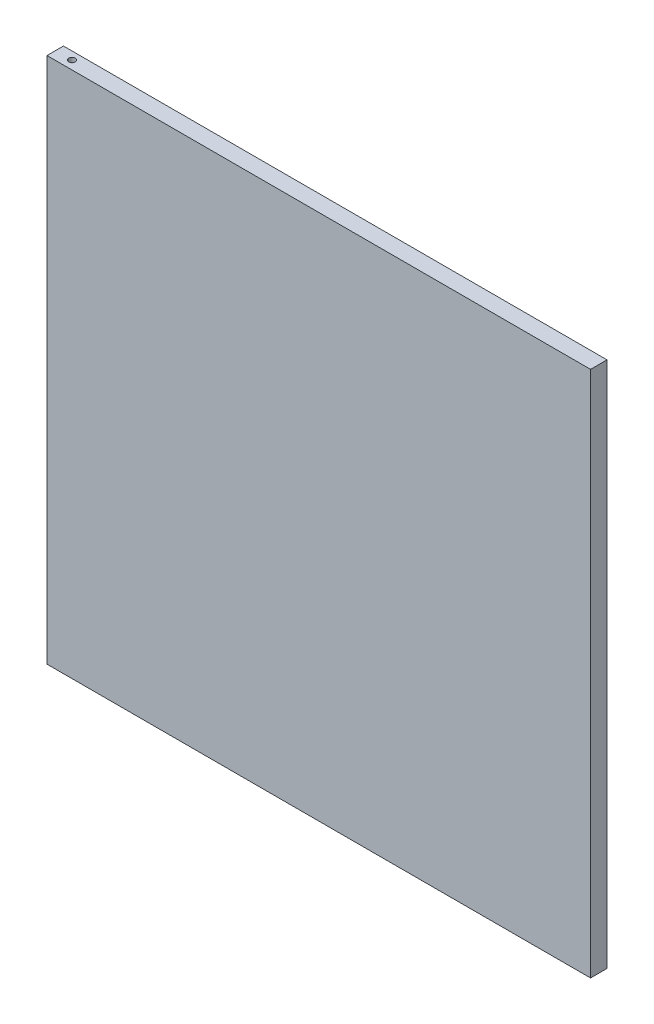
ISO-10303-21;
HEADER;
FILE_DESCRIPTION(('STEP AP214'),'2;1');
FILE_NAME('part.step','',(''),(''),'','','');
FILE_SCHEMA(('AUTOMOTIVE_DESIGN { 1 0 10303 214 1 1 1 1 }'));
ENDSEC;
DATA;
#1=APPLICATION_CONTEXT('core data for automotive mechanical design processes');
#2=APPLICATION_PROTOCOL_DEFINITION('international standard','automotive_design',2000,#1);
#3=PRODUCT_CONTEXT('',#1,'mechanical');
#4=PRODUCT('Part','Part','',(#3));
#5=PRODUCT_RELATED_PRODUCT_CATEGORY('part','',(#4));
#6=PRODUCT_DEFINITION_FORMATION('','',#4);
#7=PRODUCT_DEFINITION_CONTEXT('part definition',#1,'design');
#8=PRODUCT_DEFINITION('design','',#6,#7);
#9=PRODUCT_DEFINITION_SHAPE('','',#8);
#10=(LENGTH_UNIT() NAMED_UNIT(*) SI_UNIT(.MILLI.,.METRE.));
#11=(NAMED_UNIT(*) PLANE_ANGLE_UNIT() SI_UNIT($,.RADIAN.));
#12=(NAMED_UNIT(*) SI_UNIT($,.STERADIAN.) SOLID_ANGLE_UNIT());
#13=UNCERTAINTY_MEASURE_WITH_UNIT(LENGTH_MEASURE(1.E-05),#10,'distance_accuracy_value','');
#14=(GEOMETRIC_REPRESENTATION_CONTEXT(3) GLOBAL_UNCERTAINTY_ASSIGNED_CONTEXT((#13)) GLOBAL_UNIT_ASSIGNED_CONTEXT((#10,
#11,#12)) REPRESENTATION_CONTEXT('',''));
#15=CARTESIAN_POINT('',(0.,0.,0.));
#16=DIRECTION('',(0.,0.,1.));
#17=DIRECTION('',(1.,0.,0.));
#18=AXIS2_PLACEMENT_3D('',#15,#16,#17);
#19=CARTESIAN_POINT('',(0.,0.,25.));
#20=DIRECTION('',(1.,0.,0.));
#21=DIRECTION('',(0.,0.,-1.));
#22=AXIS2_PLACEMENT_3D('',#19,#20,#21);
#23=PLANE('',#22);
#24=DIRECTION('',(0.,-1.,0.));
#25=VECTOR('',#24,1.);
#26=CARTESIAN_POINT('',(0.,0.,0.));
#27=LINE('',#26,#25);
#28=CARTESIAN_POINT('',(0.,800.,0.));
#29=VERTEX_POINT('',#28);
#30=CARTESIAN_POINT('',(0.,0.,0.));
#31=VERTEX_POINT('',#30);
#32=EDGE_CURVE('E96',#29,#31,#27,.T.);
#33=ORIENTED_EDGE('',*,*,#32,.T.);
#34=DIRECTION('',(0.,0.,-1.));
#35=VECTOR('',#34,1.);
#36=CARTESIAN_POINT('',(0.,0.,25.));
#37=LINE('',#36,#35);
#38=CARTESIAN_POINT('',(0.,0.,25.));
#39=VERTEX_POINT('',#38);
#40=EDGE_CURVE('E11',#39,#31,#37,.T.);
#41=ORIENTED_EDGE('',*,*,#40,.F.);
#42=DIRECTION('',(0.,-1.,0.));
#43=VECTOR('',#42,1.);
#44=CARTESIAN_POINT('',(0.,0.,25.));
#45=LINE('',#44,#43);
#46=CARTESIAN_POINT('',(0.,800.,25.));
#47=VERTEX_POINT('',#46);
#48=EDGE_CURVE('E84',#47,#39,#45,.T.);
#49=ORIENTED_EDGE('',*,*,#48,.F.);
#50=DIRECTION('',(0.,0.,-1.));
#51=VECTOR('',#50,1.);
#52=CARTESIAN_POINT('',(0.,800.,25.));
#53=LINE('',#52,#51);
#54=EDGE_CURVE('E92',#47,#29,#53,.T.);
#55=ORIENTED_EDGE('',*,*,#54,.T.);
#56=EDGE_LOOP('',(#33,#41,#49,#55));
#57=FACE_BOUND('',#56,.T.);
#58=ADVANCED_FACE('F33',(#57),#23,.F.);
#59=CARTESIAN_POINT('',(0.,0.,25.));
#60=DIRECTION('',(0.,1.,0.));
#61=DIRECTION('',(0.,0.,1.));
#62=AXIS2_PLACEMENT_3D('',#59,#60,#61);
#63=PLANE('',#62);
#64=CARTESIAN_POINT('',(25.,0.,12.));
#65=DIRECTION('',(0.,1.,0.));
#66=DIRECTION('',(0.,0.,1.));
#67=AXIS2_PLACEMENT_3D('',#64,#65,#66);
#68=CIRCLE('',#67,5.);
#69=CARTESIAN_POINT('',(25.,0.,17.));
#70=VERTEX_POINT('',#69);
#71=EDGE_CURVE('E110',#70,#70,#68,.T.);
#72=ORIENTED_EDGE('',*,*,#71,.T.);
#73=EDGE_LOOP('',(#72));
#74=FACE_BOUND('',#73,.T.);
#75=DIRECTION('',(1.,0.,0.));
#76=VECTOR('',#75,1.);
#77=CARTESIAN_POINT('',(0.,0.,0.));
#78=LINE('',#77,#76);
#79=CARTESIAN_POINT('',(825.,0.,0.));
#80=VERTEX_POINT('',#79);
#81=EDGE_CURVE('E88',#31,#80,#78,.T.);
#82=ORIENTED_EDGE('',*,*,#81,.T.);
#83=DIRECTION('',(0.,0.,-1.));
#84=VECTOR('',#83,1.);
#85=CARTESIAN_POINT('',(825.,0.,25.));
#86=LINE('',#85,#84);
#87=CARTESIAN_POINT('',(825.,0.,25.));
#88=VERTEX_POINT('',#87);
#89=EDGE_CURVE('E41',#88,#80,#86,.T.);
#90=ORIENTED_EDGE('',*,*,#89,.F.);
#91=DIRECTION('',(1.,0.,0.));
#92=VECTOR('',#91,1.);
#93=CARTESIAN_POINT('',(0.,0.,25.));
#94=LINE('',#93,#92);
#95=EDGE_CURVE('E79',#39,#88,#94,.T.);
#96=ORIENTED_EDGE('',*,*,#95,.F.);
#97=ORIENTED_EDGE('',*,*,#40,.T.);
#98=EDGE_LOOP('',(#82,#90,#96,#97));
#99=FACE_BOUND('',#98,.T.);
#100=ADVANCED_FACE('F87',(#74,#99),#63,.F.);
#101=CARTESIAN_POINT('',(825.,0.,25.));
#102=DIRECTION('',(-1.,0.,0.));
#103=DIRECTION('',(0.,-1.,0.));
#104=AXIS2_PLACEMENT_3D('',#101,#102,#103);
#105=PLANE('',#104);
#106=DIRECTION('',(0.,1.,0.));
#107=VECTOR('',#106,1.);
#108=CARTESIAN_POINT('',(825.,0.,0.));
#109=LINE('',#108,#107);
#110=CARTESIAN_POINT('',(825.,800.,0.));
#111=VERTEX_POINT('',#110);
#112=EDGE_CURVE('E66',#80,#111,#109,.T.);
#113=ORIENTED_EDGE('',*,*,#112,.T.);
#114=DIRECTION('',(0.,0.,-1.));
#115=VECTOR('',#114,1.);
#116=CARTESIAN_POINT('',(825.,800.,25.));
#117=LINE('',#116,#115);
#118=CARTESIAN_POINT('',(825.,800.,25.));
#119=VERTEX_POINT('',#118);
#120=EDGE_CURVE('E89',#119,#111,#117,.T.);
#121=ORIENTED_EDGE('',*,*,#120,.F.);
#122=DIRECTION('',(0.,1.,0.));
#123=VECTOR('',#122,1.);
#124=CARTESIAN_POINT('',(825.,0.,25.));
#125=LINE('',#124,#123);
#126=EDGE_CURVE('E82',#88,#119,#125,.T.);
#127=ORIENTED_EDGE('',*,*,#126,.F.);
#128=ORIENTED_EDGE('',*,*,#89,.T.);
#129=EDGE_LOOP('',(#113,#121,#127,#128));
#130=FACE_BOUND('',#129,.T.);
#131=ADVANCED_FACE('F90',(#130),#105,.F.);
#132=CARTESIAN_POINT('',(0.,800.,25.));
#133=DIRECTION('',(0.,-1.,0.));
#134=DIRECTION('',(0.,0.,-1.));
#135=AXIS2_PLACEMENT_3D('',#132,#133,#134);
#136=PLANE('',#135);
#137=CARTESIAN_POINT('',(25.,800.,12.));
#138=DIRECTION('',(0.,1.,0.));
#139=DIRECTION('',(0.,0.,1.));
#140=AXIS2_PLACEMENT_3D('',#137,#138,#139);
#141=CIRCLE('',#140,5.);
#142=CARTESIAN_POINT('',(25.,800.,17.));
#143=VERTEX_POINT('',#142);
#144=EDGE_CURVE('E116',#143,#143,#141,.T.);
#145=ORIENTED_EDGE('',*,*,#144,.F.);
#146=EDGE_LOOP('',(#145));
#147=FACE_BOUND('',#146,.T.);
#148=DIRECTION('',(-1.,0.,0.));
#149=VECTOR('',#148,1.);
#150=CARTESIAN_POINT('',(0.,800.,0.));
#151=LINE('',#150,#149);
#152=EDGE_CURVE('E72',#111,#29,#151,.T.);
#153=ORIENTED_EDGE('',*,*,#152,.T.);
#154=ORIENTED_EDGE('',*,*,#54,.F.);
#155=DIRECTION('',(-1.,0.,0.));
#156=VECTOR('',#155,1.);
#157=CARTESIAN_POINT('',(0.,800.,25.));
#158=LINE('',#157,#156);
#159=EDGE_CURVE('E49',#119,#47,#158,.T.);
#160=ORIENTED_EDGE('',*,*,#159,.F.);
#161=ORIENTED_EDGE('',*,*,#120,.T.);
#162=EDGE_LOOP('',(#153,#154,#160,#161));
#163=FACE_BOUND('',#162,.T.);
#164=ADVANCED_FACE('F104',(#147,#163),#136,.F.);
#165=CARTESIAN_POINT('',(0.,0.,25.));
#166=DIRECTION('',(0.,0.,-1.));
#167=DIRECTION('',(-1.,0.,0.));
#168=AXIS2_PLACEMENT_3D('',#165,#166,#167);
#169=PLANE('',#168);
#170=ORIENTED_EDGE('',*,*,#48,.T.);
#171=ORIENTED_EDGE('',*,*,#95,.T.);
#172=ORIENTED_EDGE('',*,*,#126,.T.);
#173=ORIENTED_EDGE('',*,*,#159,.T.);
#174=EDGE_LOOP('',(#170,#171,#172,#173));
#175=FACE_BOUND('',#174,.T.);
#176=ADVANCED_FACE('F80',(#175),#169,.F.);
#177=CARTESIAN_POINT('',(0.,0.,0.));
#178=DIRECTION('',(0.,0.,-1.));
#179=DIRECTION('',(-1.,0.,0.));
#180=AXIS2_PLACEMENT_3D('',#177,#178,#179);
#181=PLANE('',#180);
#182=ORIENTED_EDGE('',*,*,#32,.F.);
#183=ORIENTED_EDGE('',*,*,#152,.F.);
#184=ORIENTED_EDGE('',*,*,#112,.F.);
#185=ORIENTED_EDGE('',*,*,#81,.F.);
#186=EDGE_LOOP('',(#182,#183,#184,#185));
#187=FACE_BOUND('',#186,.T.);
#188=ADVANCED_FACE('F107',(#187),#181,.T.);
#189=CARTESIAN_POINT('',(25.,40.,12.));
#190=DIRECTION('',(0.,-1.,0.));
#191=DIRECTION('',(0.,0.,-1.));
#192=AXIS2_PLACEMENT_3D('',#189,#190,#191);
#193=CYLINDRICAL_SURFACE('',#192,5.);
#194=CARTESIAN_POINT('',(25.,40.,12.));
#195=DIRECTION('',(0.,1.,0.));
#196=DIRECTION('',(0.,0.,1.));
#197=AXIS2_PLACEMENT_3D('',#194,#195,#196);
#198=CIRCLE('',#197,5.);
#199=CARTESIAN_POINT('',(25.,40.,17.));
#200=VERTEX_POINT('',#199);
#201=EDGE_CURVE('E99',#200,#200,#198,.T.);
#202=ORIENTED_EDGE('',*,*,#201,.T.);
#203=EDGE_LOOP('',(#202));
#204=FACE_BOUND('',#203,.T.);
#205=ORIENTED_EDGE('',*,*,#71,.F.);
#206=EDGE_LOOP('',(#205));
#207=FACE_BOUND('',#206,.T.);
#208=ADVANCED_FACE('F149',(#204,#207),#193,.F.);
#209=CARTESIAN_POINT('',(25.,40.,12.));
#210=DIRECTION('',(0.,1.,0.));
#211=DIRECTION('',(0.,0.,1.));
#212=AXIS2_PLACEMENT_3D('',#209,#210,#211);
#213=PLANE('',#212);
#214=ORIENTED_EDGE('',*,*,#201,.F.);
#215=EDGE_LOOP('',(#214));
#216=FACE_BOUND('',#215,.T.);
#217=ADVANCED_FACE('F127',(#216),#213,.F.);
#218=CARTESIAN_POINT('',(25.,760.,12.));
#219=DIRECTION('',(0.,1.,0.));
#220=DIRECTION('',(0.,0.,1.));
#221=AXIS2_PLACEMENT_3D('',#218,#219,#220);
#222=CYLINDRICAL_SURFACE('',#221,5.);
#223=CARTESIAN_POINT('',(25.,760.,12.));
#224=DIRECTION('',(0.,1.,0.));
#225=DIRECTION('',(0.,0.,1.));
#226=AXIS2_PLACEMENT_3D('',#223,#224,#225);
#227=CIRCLE('',#226,5.);
#228=CARTESIAN_POINT('',(25.,760.,17.));
#229=VERTEX_POINT('',#228);
#230=EDGE_CURVE('E113',#229,#229,#227,.T.);
#231=ORIENTED_EDGE('',*,*,#230,.F.);
#232=EDGE_LOOP('',(#231));
#233=FACE_BOUND('',#232,.T.);
#234=ORIENTED_EDGE('',*,*,#144,.T.);
#235=EDGE_LOOP('',(#234));
#236=FACE_BOUND('',#235,.T.);
#237=ADVANCED_FACE('F124',(#233,#236),#222,.F.);
#238=CARTESIAN_POINT('',(25.,760.,12.));
#239=DIRECTION('',(0.,-1.,0.));
#240=DIRECTION('',(0.,0.,1.));
#241=AXIS2_PLACEMENT_3D('',#238,#239,#240);
#242=PLANE('',#241);
#243=ORIENTED_EDGE('',*,*,#230,.T.);
#244=EDGE_LOOP('',(#243));
#245=FACE_BOUND('',#244,.T.);
#246=ADVANCED_FACE('F122',(#245),#242,.F.);
#247=CLOSED_SHELL('',(#58,#100,#131,#164,#176,#188,#208,#217,#237,#246));
#248=MANIFOLD_SOLID_BREP('B2',#247);
#249=ADVANCED_BREP_SHAPE_REPRESENTATION('',(#18,#248),#14);
#250=SHAPE_DEFINITION_REPRESENTATION(#9,#249);
ENDSEC;
END-ISO-10303-21;
